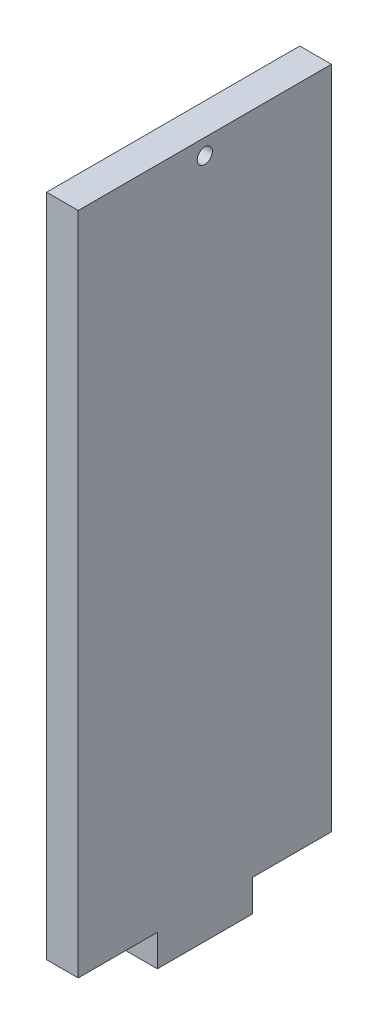
ISO-10303-21;
HEADER;
FILE_DESCRIPTION(('STEP AP214'),'2;1');
FILE_NAME('part.step','',(''),(''),'','','');
FILE_SCHEMA(('AUTOMOTIVE_DESIGN { 1 0 10303 214 1 1 1 1 }'));
ENDSEC;
DATA;
#1=APPLICATION_CONTEXT('core data for automotive mechanical design processes');
#2=APPLICATION_PROTOCOL_DEFINITION('international standard','automotive_design',2000,#1);
#3=PRODUCT_CONTEXT('',#1,'mechanical');
#4=PRODUCT('Part','Part','',(#3));
#5=PRODUCT_RELATED_PRODUCT_CATEGORY('part','',(#4));
#6=PRODUCT_DEFINITION_FORMATION('','',#4);
#7=PRODUCT_DEFINITION_CONTEXT('part definition',#1,'design');
#8=PRODUCT_DEFINITION('design','',#6,#7);
#9=PRODUCT_DEFINITION_SHAPE('','',#8);
#10=(LENGTH_UNIT() NAMED_UNIT(*) SI_UNIT(.MILLI.,.METRE.));
#11=(NAMED_UNIT(*) PLANE_ANGLE_UNIT() SI_UNIT($,.RADIAN.));
#12=(NAMED_UNIT(*) SI_UNIT($,.STERADIAN.) SOLID_ANGLE_UNIT());
#13=UNCERTAINTY_MEASURE_WITH_UNIT(LENGTH_MEASURE(1.E-05),#10,'distance_accuracy_value','');
#14=(GEOMETRIC_REPRESENTATION_CONTEXT(3) GLOBAL_UNCERTAINTY_ASSIGNED_CONTEXT((#13)) GLOBAL_UNIT_ASSIGNED_CONTEXT((#10,
#11,#12)) REPRESENTATION_CONTEXT('',''));
#15=CARTESIAN_POINT('',(0.,0.,0.));
#16=DIRECTION('',(0.,0.,1.));
#17=DIRECTION('',(1.,0.,0.));
#18=AXIS2_PLACEMENT_3D('',#15,#16,#17);
#19=CARTESIAN_POINT('',(6.35,0.,0.));
#20=DIRECTION('',(0.,1.,0.));
#21=DIRECTION('',(0.,0.,1.));
#22=AXIS2_PLACEMENT_3D('',#19,#20,#21);
#23=PLANE('',#22);
#24=DIRECTION('',(1.,0.,0.));
#25=VECTOR('',#24,1.);
#26=CARTESIAN_POINT('',(0.,0.,-34.925));
#27=LINE('',#26,#25);
#28=CARTESIAN_POINT('',(0.,0.,-34.925));
#29=VERTEX_POINT('',#28);
#30=CARTESIAN_POINT('',(6.35,0.,-34.925));
#31=VERTEX_POINT('',#30);
#32=EDGE_CURVE('E78',#29,#31,#27,.T.);
#33=ORIENTED_EDGE('',*,*,#32,.F.);
#34=DIRECTION('',(0.,0.,-1.));
#35=VECTOR('',#34,1.);
#36=CARTESIAN_POINT('',(0.,0.,0.));
#37=LINE('',#36,#35);
#38=CARTESIAN_POINT('',(0.,0.,-50.8));
#39=VERTEX_POINT('',#38);
#40=EDGE_CURVE('E73',#29,#39,#37,.T.);
#41=ORIENTED_EDGE('',*,*,#40,.T.);
#42=DIRECTION('',(-1.,0.,0.));
#43=VECTOR('',#42,1.);
#44=CARTESIAN_POINT('',(6.35,0.,-50.8));
#45=LINE('',#44,#43);
#46=CARTESIAN_POINT('',(6.35,0.,-50.8));
#47=VERTEX_POINT('',#46);
#48=EDGE_CURVE('E42',#47,#39,#45,.T.);
#49=ORIENTED_EDGE('',*,*,#48,.F.);
#50=DIRECTION('',(0.,0.,-1.));
#51=VECTOR('',#50,1.);
#52=CARTESIAN_POINT('',(6.35,0.,0.));
#53=LINE('',#52,#51);
#54=EDGE_CURVE('E59',#31,#47,#53,.T.);
#55=ORIENTED_EDGE('',*,*,#54,.F.);
#56=EDGE_LOOP('',(#33,#41,#49,#55));
#57=FACE_BOUND('',#56,.T.);
#58=ADVANCED_FACE('F33',(#57),#23,.F.);
#59=CARTESIAN_POINT('',(6.35,0.,0.));
#60=DIRECTION('',(0.,0.,-1.));
#61=DIRECTION('',(0.,1.,0.));
#62=AXIS2_PLACEMENT_3D('',#59,#60,#61);
#63=PLANE('',#62);
#64=DIRECTION('',(0.,-1.,0.));
#65=VECTOR('',#64,1.);
#66=CARTESIAN_POINT('',(0.,0.,0.));
#67=LINE('',#66,#65);
#68=CARTESIAN_POINT('',(0.,133.35,0.));
#69=VERTEX_POINT('',#68);
#70=CARTESIAN_POINT('',(0.,0.,0.));
#71=VERTEX_POINT('',#70);
#72=EDGE_CURVE('E83',#69,#71,#67,.T.);
#73=ORIENTED_EDGE('',*,*,#72,.T.);
#74=DIRECTION('',(-1.,0.,0.));
#75=VECTOR('',#74,1.);
#76=CARTESIAN_POINT('',(6.35,0.,0.));
#77=LINE('',#76,#75);
#78=CARTESIAN_POINT('',(6.35,0.,0.));
#79=VERTEX_POINT('',#78);
#80=EDGE_CURVE('E11',#79,#71,#77,.T.);
#81=ORIENTED_EDGE('',*,*,#80,.F.);
#82=DIRECTION('',(0.,-1.,0.));
#83=VECTOR('',#82,1.);
#84=CARTESIAN_POINT('',(6.35,0.,0.));
#85=LINE('',#84,#83);
#86=CARTESIAN_POINT('',(6.35,133.35,0.));
#87=VERTEX_POINT('',#86);
#88=EDGE_CURVE('E99',#87,#79,#85,.T.);
#89=ORIENTED_EDGE('',*,*,#88,.F.);
#90=DIRECTION('',(-1.,0.,0.));
#91=VECTOR('',#90,1.);
#92=CARTESIAN_POINT('',(6.35,133.35,0.));
#93=LINE('',#92,#91);
#94=EDGE_CURVE('E159',#87,#69,#93,.T.);
#95=ORIENTED_EDGE('',*,*,#94,.T.);
#96=EDGE_LOOP('',(#73,#81,#89,#95));
#97=FACE_BOUND('',#96,.T.);
#98=ADVANCED_FACE('F35',(#97),#63,.F.);
#99=CARTESIAN_POINT('',(0.,0.,-15.875));
#100=VERTEX_POINT('',#99);
#101=EDGE_CURVE('E82',#71,#100,#37,.T.);
#102=ORIENTED_EDGE('',*,*,#101,.T.);
#103=DIRECTION('',(1.,0.,0.));
#104=VECTOR('',#103,1.);
#105=CARTESIAN_POINT('',(0.,0.,-15.875));
#106=LINE('',#105,#104);
#107=CARTESIAN_POINT('',(6.35,0.,-15.875));
#108=VERTEX_POINT('',#107);
#109=EDGE_CURVE('E119',#100,#108,#106,.T.);
#110=ORIENTED_EDGE('',*,*,#109,.T.);
#111=EDGE_CURVE('E109',#79,#108,#53,.T.);
#112=ORIENTED_EDGE('',*,*,#111,.F.);
#113=ORIENTED_EDGE('',*,*,#80,.T.);
#114=EDGE_LOOP('',(#102,#110,#112,#113));
#115=FACE_BOUND('',#114,.T.);
#116=ADVANCED_FACE('F198',(#115),#23,.F.);
#117=CARTESIAN_POINT('',(6.35,0.,-50.8));
#118=DIRECTION('',(0.,0.,1.));
#119=DIRECTION('',(0.,-1.,0.));
#120=AXIS2_PLACEMENT_3D('',#117,#118,#119);
#121=PLANE('',#120);
#122=DIRECTION('',(0.,1.,0.));
#123=VECTOR('',#122,1.);
#124=CARTESIAN_POINT('',(0.,0.,-50.8));
#125=LINE('',#124,#123);
#126=CARTESIAN_POINT('',(0.,133.35,-50.8));
#127=VERTEX_POINT('',#126);
#128=EDGE_CURVE('E90',#39,#127,#125,.T.);
#129=ORIENTED_EDGE('',*,*,#128,.T.);
#130=DIRECTION('',(-1.,0.,0.));
#131=VECTOR('',#130,1.);
#132=CARTESIAN_POINT('',(6.35,133.35,-50.8));
#133=LINE('',#132,#131);
#134=CARTESIAN_POINT('',(6.35,133.35,-50.8));
#135=VERTEX_POINT('',#134);
#136=EDGE_CURVE('E157',#135,#127,#133,.T.);
#137=ORIENTED_EDGE('',*,*,#136,.F.);
#138=DIRECTION('',(0.,1.,0.));
#139=VECTOR('',#138,1.);
#140=CARTESIAN_POINT('',(6.35,0.,-50.8));
#141=LINE('',#140,#139);
#142=EDGE_CURVE('E92',#47,#135,#141,.T.);
#143=ORIENTED_EDGE('',*,*,#142,.F.);
#144=ORIENTED_EDGE('',*,*,#48,.T.);
#145=EDGE_LOOP('',(#129,#137,#143,#144));
#146=FACE_BOUND('',#145,.T.);
#147=ADVANCED_FACE('F87',(#146),#121,.F.);
#148=CARTESIAN_POINT('',(6.35,0.,0.));
#149=DIRECTION('',(-1.,0.,0.));
#150=DIRECTION('',(0.,0.,1.));
#151=AXIS2_PLACEMENT_3D('',#148,#149,#150);
#152=PLANE('',#151);
#153=CARTESIAN_POINT('',(6.35,130.175,-25.4));
#154=DIRECTION('',(1.,0.,0.));
#155=DIRECTION('',(0.,0.,-1.));
#156=AXIS2_PLACEMENT_3D('',#153,#154,#155);
#157=CIRCLE('',#156,1.524);
#158=CARTESIAN_POINT('',(6.35,130.175,-26.924));
#159=VERTEX_POINT('',#158);
#160=EDGE_CURVE('E215',#159,#159,#157,.T.);
#161=ORIENTED_EDGE('',*,*,#160,.F.);
#162=EDGE_LOOP('',(#161));
#163=FACE_BOUND('',#162,.T.);
#164=ORIENTED_EDGE('',*,*,#88,.T.);
#165=ORIENTED_EDGE('',*,*,#111,.T.);
#166=DIRECTION('',(0.,-1.,0.));
#167=VECTOR('',#166,1.);
#168=CARTESIAN_POINT('',(6.35,0.,-15.875));
#169=LINE('',#168,#167);
#170=CARTESIAN_POINT('',(6.35,-6.35,-15.875));
#171=VERTEX_POINT('',#170);
#172=EDGE_CURVE('E50',#108,#171,#169,.T.);
#173=ORIENTED_EDGE('',*,*,#172,.T.);
#174=DIRECTION('',(0.,0.,-1.));
#175=VECTOR('',#174,1.);
#176=CARTESIAN_POINT('',(6.35,-6.35,-15.875));
#177=LINE('',#176,#175);
#178=CARTESIAN_POINT('',(6.35,-6.35,-34.925));
#179=VERTEX_POINT('',#178);
#180=EDGE_CURVE('E136',#171,#179,#177,.T.);
#181=ORIENTED_EDGE('',*,*,#180,.T.);
#182=DIRECTION('',(0.,1.,0.));
#183=VECTOR('',#182,1.);
#184=CARTESIAN_POINT('',(6.35,0.,-34.925));
#185=LINE('',#184,#183);
#186=EDGE_CURVE('E149',#179,#31,#185,.T.);
#187=ORIENTED_EDGE('',*,*,#186,.T.);
#188=ORIENTED_EDGE('',*,*,#54,.T.);
#189=ORIENTED_EDGE('',*,*,#142,.T.);
#190=DIRECTION('',(0.,0.,-1.));
#191=VECTOR('',#190,1.);
#192=CARTESIAN_POINT('',(6.35,133.35,-50.8));
#193=LINE('',#192,#191);
#194=EDGE_CURVE('E163',#87,#135,#193,.T.);
#195=ORIENTED_EDGE('',*,*,#194,.F.);
#196=EDGE_LOOP('',(#164,#165,#173,#181,#187,#188,#189,#195));
#197=FACE_BOUND('',#196,.T.);
#198=ADVANCED_FACE('F207',(#163,#197),#152,.F.);
#199=CARTESIAN_POINT('',(0.,0.,0.));
#200=DIRECTION('',(-1.,0.,0.));
#201=DIRECTION('',(0.,0.,1.));
#202=AXIS2_PLACEMENT_3D('',#199,#200,#201);
#203=PLANE('',#202);
#204=CARTESIAN_POINT('',(0.,130.175,-25.4));
#205=DIRECTION('',(-1.,0.,0.));
#206=DIRECTION('',(0.,0.,1.));
#207=AXIS2_PLACEMENT_3D('',#204,#205,#206);
#208=CIRCLE('',#207,1.524);
#209=CARTESIAN_POINT('',(0.,130.175,-23.876));
#210=VERTEX_POINT('',#209);
#211=EDGE_CURVE('E37',#210,#210,#208,.T.);
#212=ORIENTED_EDGE('',*,*,#211,.F.);
#213=EDGE_LOOP('',(#212));
#214=FACE_BOUND('',#213,.T.);
#215=ORIENTED_EDGE('',*,*,#72,.F.);
#216=DIRECTION('',(0.,0.,-1.));
#217=VECTOR('',#216,1.);
#218=CARTESIAN_POINT('',(0.,133.35,-50.8));
#219=LINE('',#218,#217);
#220=EDGE_CURVE('E98',#69,#127,#219,.T.);
#221=ORIENTED_EDGE('',*,*,#220,.T.);
#222=ORIENTED_EDGE('',*,*,#128,.F.);
#223=ORIENTED_EDGE('',*,*,#40,.F.);
#224=DIRECTION('',(0.,1.,0.));
#225=VECTOR('',#224,1.);
#226=CARTESIAN_POINT('',(0.,0.,-34.925));
#227=LINE('',#226,#225);
#228=CARTESIAN_POINT('',(0.,-6.35,-34.925));
#229=VERTEX_POINT('',#228);
#230=EDGE_CURVE('E142',#229,#29,#227,.T.);
#231=ORIENTED_EDGE('',*,*,#230,.F.);
#232=DIRECTION('',(0.,0.,-1.));
#233=VECTOR('',#232,1.);
#234=CARTESIAN_POINT('',(0.,-6.35,-15.875));
#235=LINE('',#234,#233);
#236=CARTESIAN_POINT('',(0.,-6.35,-15.875));
#237=VERTEX_POINT('',#236);
#238=EDGE_CURVE('E146',#237,#229,#235,.T.);
#239=ORIENTED_EDGE('',*,*,#238,.F.);
#240=DIRECTION('',(0.,-1.,0.));
#241=VECTOR('',#240,1.);
#242=CARTESIAN_POINT('',(0.,0.,-15.875));
#243=LINE('',#242,#241);
#244=EDGE_CURVE('E131',#100,#237,#243,.T.);
#245=ORIENTED_EDGE('',*,*,#244,.F.);
#246=ORIENTED_EDGE('',*,*,#101,.F.);
#247=EDGE_LOOP('',(#215,#221,#222,#223,#231,#239,#245,#246));
#248=FACE_BOUND('',#247,.T.);
#249=ADVANCED_FACE('F96',(#214,#248),#203,.T.);
#250=CARTESIAN_POINT('',(0.,0.,-15.875));
#251=DIRECTION('',(0.,0.,1.));
#252=DIRECTION('',(1.,0.,0.));
#253=AXIS2_PLACEMENT_3D('',#250,#251,#252);
#254=PLANE('',#253);
#255=ORIENTED_EDGE('',*,*,#172,.F.);
#256=ORIENTED_EDGE('',*,*,#109,.F.);
#257=ORIENTED_EDGE('',*,*,#244,.T.);
#258=DIRECTION('',(1.,0.,0.));
#259=VECTOR('',#258,1.);
#260=CARTESIAN_POINT('',(0.,-6.35,-15.875));
#261=LINE('',#260,#259);
#262=EDGE_CURVE('E145',#237,#171,#261,.T.);
#263=ORIENTED_EDGE('',*,*,#262,.T.);
#264=EDGE_LOOP('',(#255,#256,#257,#263));
#265=FACE_BOUND('',#264,.T.);
#266=ADVANCED_FACE('F179',(#265),#254,.T.);
#267=CARTESIAN_POINT('',(0.,0.,-34.925));
#268=DIRECTION('',(0.,0.,-1.));
#269=DIRECTION('',(-1.,0.,0.));
#270=AXIS2_PLACEMENT_3D('',#267,#268,#269);
#271=PLANE('',#270);
#272=ORIENTED_EDGE('',*,*,#186,.F.);
#273=DIRECTION('',(1.,0.,0.));
#274=VECTOR('',#273,1.);
#275=CARTESIAN_POINT('',(0.,-6.35,-34.925));
#276=LINE('',#275,#274);
#277=EDGE_CURVE('E125',#229,#179,#276,.T.);
#278=ORIENTED_EDGE('',*,*,#277,.F.);
#279=ORIENTED_EDGE('',*,*,#230,.T.);
#280=ORIENTED_EDGE('',*,*,#32,.T.);
#281=EDGE_LOOP('',(#272,#278,#279,#280));
#282=FACE_BOUND('',#281,.T.);
#283=ADVANCED_FACE('F186',(#282),#271,.T.);
#284=CARTESIAN_POINT('',(0.,-6.35,-15.875));
#285=DIRECTION('',(0.,-1.,0.));
#286=DIRECTION('',(0.,0.,-1.));
#287=AXIS2_PLACEMENT_3D('',#284,#285,#286);
#288=PLANE('',#287);
#289=ORIENTED_EDGE('',*,*,#180,.F.);
#290=ORIENTED_EDGE('',*,*,#262,.F.);
#291=ORIENTED_EDGE('',*,*,#238,.T.);
#292=ORIENTED_EDGE('',*,*,#277,.T.);
#293=EDGE_LOOP('',(#289,#290,#291,#292));
#294=FACE_BOUND('',#293,.T.);
#295=ADVANCED_FACE('F173',(#294),#288,.T.);
#296=CARTESIAN_POINT('',(6.35,133.35,-50.8));
#297=DIRECTION('',(0.,1.,0.));
#298=DIRECTION('',(0.,0.,1.));
#299=AXIS2_PLACEMENT_3D('',#296,#297,#298);
#300=PLANE('',#299);
#301=ORIENTED_EDGE('',*,*,#220,.F.);
#302=ORIENTED_EDGE('',*,*,#94,.F.);
#303=ORIENTED_EDGE('',*,*,#194,.T.);
#304=ORIENTED_EDGE('',*,*,#136,.T.);
#305=EDGE_LOOP('',(#301,#302,#303,#304));
#306=FACE_BOUND('',#305,.T.);
#307=ADVANCED_FACE('F193',(#306),#300,.T.);
#308=CARTESIAN_POINT('',(-4.99999999997031E-05,130.175,-25.4));
#309=DIRECTION('',(1.,0.,0.));
#310=DIRECTION('',(0.,0.,-1.));
#311=AXIS2_PLACEMENT_3D('',#308,#309,#310);
#312=CYLINDRICAL_SURFACE('',#311,1.524);
#313=ORIENTED_EDGE('',*,*,#211,.T.);
#314=EDGE_LOOP('',(#313));
#315=FACE_BOUND('',#314,.T.);
#316=ORIENTED_EDGE('',*,*,#160,.T.);
#317=EDGE_LOOP('',(#316));
#318=FACE_BOUND('',#317,.T.);
#319=ADVANCED_FACE('F222',(#315,#318),#312,.F.);
#320=CLOSED_SHELL('',(#58,#98,#116,#147,#198,#249,#266,#283,#295,#307,#319));
#321=MANIFOLD_SOLID_BREP('B2',#320);
#322=ADVANCED_BREP_SHAPE_REPRESENTATION('',(#18,#321),#14);
#323=SHAPE_DEFINITION_REPRESENTATION(#9,#322);
ENDSEC;
END-ISO-10303-21;
